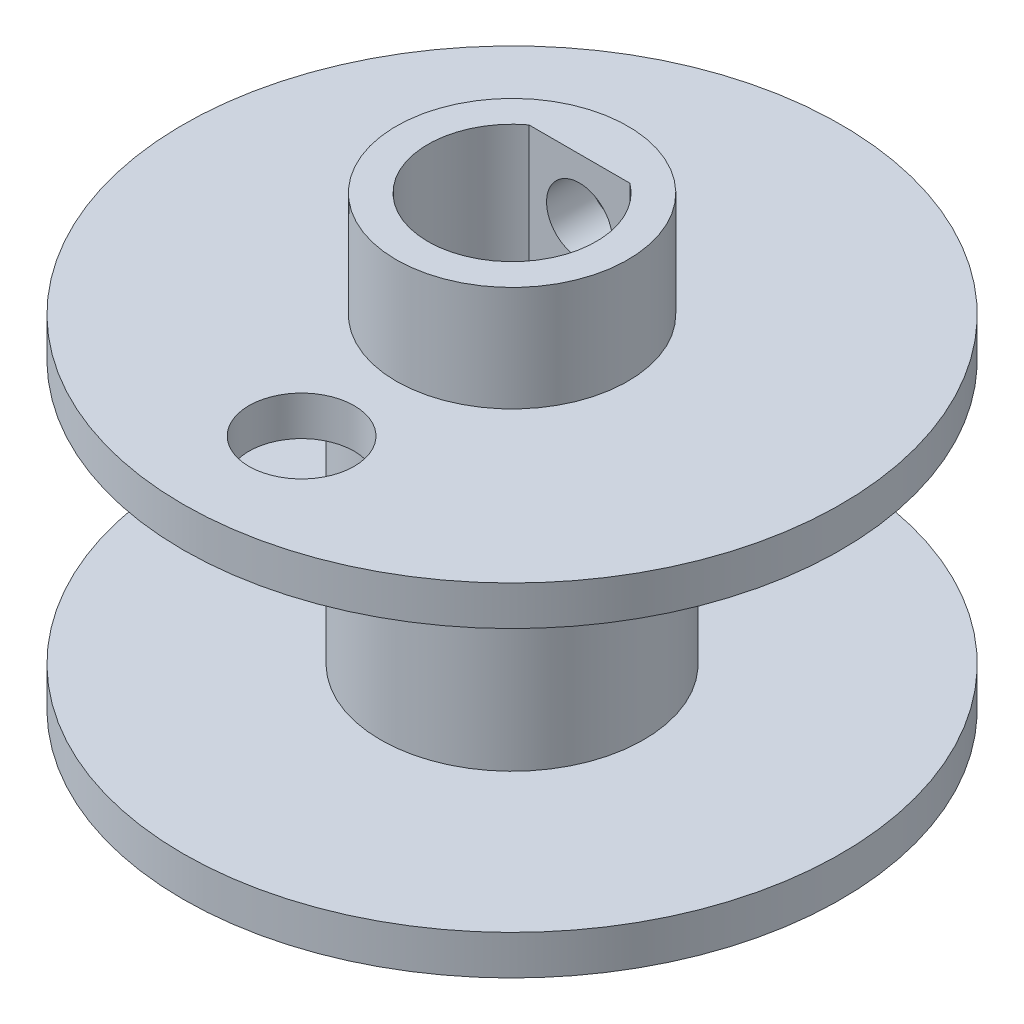
ISO-10303-21;
HEADER;
FILE_DESCRIPTION(('STEP AP214'),'2;1');
FILE_NAME('part.step','',(''),(''),'','','');
FILE_SCHEMA(('AUTOMOTIVE_DESIGN { 1 0 10303 214 1 1 1 1 }'));
ENDSEC;
DATA;
#1=APPLICATION_CONTEXT('core data for automotive mechanical design processes');
#2=APPLICATION_PROTOCOL_DEFINITION('international standard','automotive_design',2000,#1);
#3=PRODUCT_CONTEXT('',#1,'mechanical');
#4=PRODUCT('Part','Part','',(#3));
#5=PRODUCT_RELATED_PRODUCT_CATEGORY('part','',(#4));
#6=PRODUCT_DEFINITION_FORMATION('','',#4);
#7=PRODUCT_DEFINITION_CONTEXT('part definition',#1,'design');
#8=PRODUCT_DEFINITION('design','',#6,#7);
#9=PRODUCT_DEFINITION_SHAPE('','',#8);
#10=(LENGTH_UNIT() NAMED_UNIT(*) SI_UNIT(.MILLI.,.METRE.));
#11=(NAMED_UNIT(*) PLANE_ANGLE_UNIT() SI_UNIT($,.RADIAN.));
#12=(NAMED_UNIT(*) SI_UNIT($,.STERADIAN.) SOLID_ANGLE_UNIT());
#13=UNCERTAINTY_MEASURE_WITH_UNIT(LENGTH_MEASURE(1.E-05),#10,'distance_accuracy_value','');
#14=(GEOMETRIC_REPRESENTATION_CONTEXT(3) GLOBAL_UNCERTAINTY_ASSIGNED_CONTEXT((#13)) GLOBAL_UNIT_ASSIGNED_CONTEXT((#10,
#11,#12)) REPRESENTATION_CONTEXT('',''));
#15=CARTESIAN_POINT('',(0.,0.,0.));
#16=DIRECTION('',(0.,0.,1.));
#17=DIRECTION('',(1.,0.,0.));
#18=AXIS2_PLACEMENT_3D('',#15,#16,#17);
#19=CARTESIAN_POINT('',(0.,5.,0.));
#20=DIRECTION('',(0.,-1.,0.));
#21=DIRECTION('',(0.,0.,-1.));
#22=AXIS2_PLACEMENT_3D('',#19,#20,#21);
#23=CYLINDRICAL_SURFACE('',#22,5.);
#24=CARTESIAN_POINT('',(0.,5.,0.));
#25=DIRECTION('',(0.,1.,0.));
#26=DIRECTION('',(0.,0.,1.));
#27=AXIS2_PLACEMENT_3D('',#24,#25,#26);
#28=CIRCLE('',#27,5.);
#29=CARTESIAN_POINT('',(0.,5.,5.));
#30=VERTEX_POINT('',#29);
#31=EDGE_CURVE('E11',#30,#30,#28,.T.);
#32=ORIENTED_EDGE('',*,*,#31,.F.);
#33=EDGE_LOOP('',(#32));
#34=FACE_BOUND('',#33,.T.);
#35=CARTESIAN_POINT('',(0.,-5.,0.));
#36=DIRECTION('',(0.,1.,0.));
#37=DIRECTION('',(0.,0.,1.));
#38=AXIS2_PLACEMENT_3D('',#35,#36,#37);
#39=CIRCLE('',#38,5.);
#40=CARTESIAN_POINT('',(0.,-5.,5.));
#41=VERTEX_POINT('',#40);
#42=EDGE_CURVE('E105',#41,#41,#39,.T.);
#43=ORIENTED_EDGE('',*,*,#42,.T.);
#44=EDGE_LOOP('',(#43));
#45=FACE_BOUND('',#44,.T.);
#46=ADVANCED_FACE('F39',(#34,#45),#23,.T.);
#47=CARTESIAN_POINT('',(0.,6.5,0.));
#48=DIRECTION('',(0.,-1.,0.));
#49=DIRECTION('',(0.,0.,-1.));
#50=AXIS2_PLACEMENT_3D('',#47,#48,#49);
#51=CYLINDRICAL_SURFACE('',#50,12.5);
#52=CARTESIAN_POINT('',(0.,6.5,0.));
#53=DIRECTION('',(0.,1.,0.));
#54=DIRECTION('',(0.,0.,1.));
#55=AXIS2_PLACEMENT_3D('',#52,#53,#54);
#56=CIRCLE('',#55,12.5);
#57=CARTESIAN_POINT('',(0.,6.5,12.5));
#58=VERTEX_POINT('',#57);
#59=EDGE_CURVE('E52',#58,#58,#56,.T.);
#60=ORIENTED_EDGE('',*,*,#59,.F.);
#61=EDGE_LOOP('',(#60));
#62=FACE_BOUND('',#61,.T.);
#63=CARTESIAN_POINT('',(0.,5.,0.));
#64=DIRECTION('',(0.,1.,0.));
#65=DIRECTION('',(0.,0.,1.));
#66=AXIS2_PLACEMENT_3D('',#63,#64,#65);
#67=CIRCLE('',#66,12.5);
#68=CARTESIAN_POINT('',(0.,5.,12.5));
#69=VERTEX_POINT('',#68);
#70=EDGE_CURVE('E110',#69,#69,#67,.T.);
#71=ORIENTED_EDGE('',*,*,#70,.T.);
#72=EDGE_LOOP('',(#71));
#73=FACE_BOUND('',#72,.T.);
#74=ADVANCED_FACE('F139',(#62,#73),#51,.T.);
#75=CARTESIAN_POINT('',(0.,6.5,0.));
#76=DIRECTION('',(0.,1.,0.));
#77=DIRECTION('',(0.,0.,1.));
#78=AXIS2_PLACEMENT_3D('',#75,#76,#77);
#79=PLANE('',#78);
#80=CARTESIAN_POINT('',(0.,6.5,8.));
#81=DIRECTION('',(0.,1.,0.));
#82=DIRECTION('',(0.,0.,1.));
#83=AXIS2_PLACEMENT_3D('',#80,#81,#82);
#84=CIRCLE('',#83,2.);
#85=CARTESIAN_POINT('',(0.,6.5,10.));
#86=VERTEX_POINT('',#85);
#87=EDGE_CURVE('E161',#86,#86,#84,.T.);
#88=ORIENTED_EDGE('',*,*,#87,.F.);
#89=EDGE_LOOP('',(#88));
#90=FACE_BOUND('',#89,.T.);
#91=CARTESIAN_POINT('',(0.,6.5,0.));
#92=DIRECTION('',(0.,1.,0.));
#93=DIRECTION('',(0.,0.,1.));
#94=AXIS2_PLACEMENT_3D('',#91,#92,#93);
#95=CIRCLE('',#94,4.4);
#96=CARTESIAN_POINT('',(0.,6.5,4.4));
#97=VERTEX_POINT('',#96);
#98=EDGE_CURVE('E83',#97,#97,#95,.T.);
#99=ORIENTED_EDGE('',*,*,#98,.F.);
#100=EDGE_LOOP('',(#99));
#101=FACE_BOUND('',#100,.T.);
#102=ORIENTED_EDGE('',*,*,#59,.T.);
#103=EDGE_LOOP('',(#102));
#104=FACE_BOUND('',#103,.T.);
#105=ADVANCED_FACE('F134',(#90,#101,#104),#79,.T.);
#106=CARTESIAN_POINT('',(0.,5.,0.));
#107=DIRECTION('',(0.,1.,0.));
#108=DIRECTION('',(0.,0.,1.));
#109=AXIS2_PLACEMENT_3D('',#106,#107,#108);
#110=PLANE('',#109);
#111=CARTESIAN_POINT('',(0.,5.,8.));
#112=DIRECTION('',(0.,-1.,0.));
#113=DIRECTION('',(0.,0.,-1.));
#114=AXIS2_PLACEMENT_3D('',#111,#112,#113);
#115=CIRCLE('',#114,2.);
#116=CARTESIAN_POINT('',(0.,5.,6.));
#117=VERTEX_POINT('',#116);
#118=EDGE_CURVE('E234',#117,#117,#115,.T.);
#119=ORIENTED_EDGE('',*,*,#118,.F.);
#120=EDGE_LOOP('',(#119));
#121=FACE_BOUND('',#120,.T.);
#122=ORIENTED_EDGE('',*,*,#31,.T.);
#123=EDGE_LOOP('',(#122));
#124=FACE_BOUND('',#123,.T.);
#125=ORIENTED_EDGE('',*,*,#70,.F.);
#126=EDGE_LOOP('',(#125));
#127=FACE_BOUND('',#126,.T.);
#128=ADVANCED_FACE('F125',(#121,#124,#127),#110,.F.);
#129=CARTESIAN_POINT('',(0.,-6.5,0.));
#130=DIRECTION('',(0.,1.,0.));
#131=DIRECTION('',(0.,0.,1.));
#132=AXIS2_PLACEMENT_3D('',#129,#130,#131);
#133=CYLINDRICAL_SURFACE('',#132,12.5);
#134=CARTESIAN_POINT('',(0.,-6.5,0.));
#135=DIRECTION('',(0.,1.,0.));
#136=DIRECTION('',(0.,0.,1.));
#137=AXIS2_PLACEMENT_3D('',#134,#135,#136);
#138=CIRCLE('',#137,12.5);
#139=CARTESIAN_POINT('',(0.,-6.5,12.5));
#140=VERTEX_POINT('',#139);
#141=EDGE_CURVE('E102',#140,#140,#138,.T.);
#142=ORIENTED_EDGE('',*,*,#141,.T.);
#143=EDGE_LOOP('',(#142));
#144=FACE_BOUND('',#143,.T.);
#145=CARTESIAN_POINT('',(0.,-5.,0.));
#146=DIRECTION('',(0.,1.,0.));
#147=DIRECTION('',(0.,0.,1.));
#148=AXIS2_PLACEMENT_3D('',#145,#146,#147);
#149=CIRCLE('',#148,12.5);
#150=CARTESIAN_POINT('',(0.,-5.,12.5));
#151=VERTEX_POINT('',#150);
#152=EDGE_CURVE('E78',#151,#151,#149,.T.);
#153=ORIENTED_EDGE('',*,*,#152,.F.);
#154=EDGE_LOOP('',(#153));
#155=FACE_BOUND('',#154,.T.);
#156=ADVANCED_FACE('F123',(#144,#155),#133,.T.);
#157=CARTESIAN_POINT('',(0.,-6.5,0.));
#158=DIRECTION('',(0.,-1.,0.));
#159=DIRECTION('',(0.,0.,1.));
#160=AXIS2_PLACEMENT_3D('',#157,#158,#159);
#161=PLANE('',#160);
#162=CARTESIAN_POINT('',(0.,-6.5,0.));
#163=DIRECTION('',(0.,1.,0.));
#164=DIRECTION('',(0.,0.,1.));
#165=AXIS2_PLACEMENT_3D('',#162,#163,#164);
#166=CIRCLE('',#165,3.2);
#167=CARTESIAN_POINT('',(-1.92,-6.5,-2.56));
#168=VERTEX_POINT('',#167);
#169=CARTESIAN_POINT('',(1.92,-6.5,-2.56));
#170=VERTEX_POINT('',#169);
#171=EDGE_CURVE('E67',#168,#170,#166,.T.);
#172=ORIENTED_EDGE('',*,*,#171,.T.);
#173=DIRECTION('',(-1.,0.,0.));
#174=VECTOR('',#173,1.);
#175=CARTESIAN_POINT('',(-1.92,-6.5,-2.56));
#176=LINE('',#175,#174);
#177=EDGE_CURVE('E99',#170,#168,#176,.T.);
#178=ORIENTED_EDGE('',*,*,#177,.T.);
#179=EDGE_LOOP('',(#172,#178));
#180=FACE_BOUND('',#179,.T.);
#181=ORIENTED_EDGE('',*,*,#141,.F.);
#182=EDGE_LOOP('',(#181));
#183=FACE_BOUND('',#182,.T.);
#184=ADVANCED_FACE('F119',(#180,#183),#161,.T.);
#185=CARTESIAN_POINT('',(0.,-5.,0.));
#186=DIRECTION('',(0.,-1.,0.));
#187=DIRECTION('',(0.,0.,1.));
#188=AXIS2_PLACEMENT_3D('',#185,#186,#187);
#189=PLANE('',#188);
#190=ORIENTED_EDGE('',*,*,#42,.F.);
#191=EDGE_LOOP('',(#190));
#192=FACE_BOUND('',#191,.T.);
#193=ORIENTED_EDGE('',*,*,#152,.T.);
#194=EDGE_LOOP('',(#193));
#195=FACE_BOUND('',#194,.T.);
#196=ADVANCED_FACE('F116',(#192,#195),#189,.F.);
#197=CARTESIAN_POINT('',(0.,-6.5,0.));
#198=DIRECTION('',(0.,1.,0.));
#199=DIRECTION('',(0.,0.,1.));
#200=AXIS2_PLACEMENT_3D('',#197,#198,#199);
#201=CYLINDRICAL_SURFACE('',#200,3.2);
#202=DIRECTION('',(0.,1.,0.));
#203=VECTOR('',#202,1.);
#204=CARTESIAN_POINT('',(-1.92,-6.5,-2.56));
#205=LINE('',#204,#203);
#206=CARTESIAN_POINT('',(-1.92,10.5,-2.56));
#207=VERTEX_POINT('',#206);
#208=EDGE_CURVE('E72',#168,#207,#205,.T.);
#209=ORIENTED_EDGE('',*,*,#208,.T.);
#210=CARTESIAN_POINT('',(0.,10.5,0.));
#211=DIRECTION('',(0.,1.,0.));
#212=DIRECTION('',(0.,0.,1.));
#213=AXIS2_PLACEMENT_3D('',#210,#211,#212);
#214=CIRCLE('',#213,3.2);
#215=CARTESIAN_POINT('',(1.92,10.5,-2.56));
#216=VERTEX_POINT('',#215);
#217=EDGE_CURVE('E75',#207,#216,#214,.T.);
#218=ORIENTED_EDGE('',*,*,#217,.T.);
#219=DIRECTION('',(0.,1.,0.));
#220=VECTOR('',#219,1.);
#221=CARTESIAN_POINT('',(1.92,-6.5,-2.56));
#222=LINE('',#221,#220);
#223=EDGE_CURVE('E60',#170,#216,#222,.T.);
#224=ORIENTED_EDGE('',*,*,#223,.F.);
#225=ORIENTED_EDGE('',*,*,#171,.F.);
#226=EDGE_LOOP('',(#209,#218,#224,#225));
#227=FACE_BOUND('',#226,.T.);
#228=ADVANCED_FACE('F73',(#227),#201,.F.);
#229=CARTESIAN_POINT('',(-1.92,-6.5,-2.56));
#230=DIRECTION('',(0.,0.,-1.));
#231=DIRECTION('',(-1.,0.,0.));
#232=AXIS2_PLACEMENT_3D('',#229,#230,#231);
#233=PLANE('',#232);
#234=CARTESIAN_POINT('',(0.,8.3,-2.56));
#235=DIRECTION('',(0.,0.,1.));
#236=DIRECTION('',(1.,0.,0.));
#237=AXIS2_PLACEMENT_3D('',#234,#235,#236);
#238=CIRCLE('',#237,1.25);
#239=CARTESIAN_POINT('',(1.25,8.3,-2.56));
#240=VERTEX_POINT('',#239);
#241=EDGE_CURVE('E89',#240,#240,#238,.T.);
#242=ORIENTED_EDGE('',*,*,#241,.F.);
#243=EDGE_LOOP('',(#242));
#244=FACE_BOUND('',#243,.T.);
#245=ORIENTED_EDGE('',*,*,#223,.T.);
#246=DIRECTION('',(-1.,0.,0.));
#247=VECTOR('',#246,1.);
#248=CARTESIAN_POINT('',(-1.92,10.5,-2.56));
#249=LINE('',#248,#247);
#250=EDGE_CURVE('E80',#216,#207,#249,.T.);
#251=ORIENTED_EDGE('',*,*,#250,.T.);
#252=ORIENTED_EDGE('',*,*,#208,.F.);
#253=ORIENTED_EDGE('',*,*,#177,.F.);
#254=EDGE_LOOP('',(#245,#251,#252,#253));
#255=FACE_BOUND('',#254,.T.);
#256=ADVANCED_FACE('F81',(#244,#255),#233,.F.);
#257=CARTESIAN_POINT('',(0.,10.5,0.));
#258=DIRECTION('',(0.,-1.,0.));
#259=DIRECTION('',(0.,0.,-1.));
#260=AXIS2_PLACEMENT_3D('',#257,#258,#259);
#261=CYLINDRICAL_SURFACE('',#260,4.4);
#262=CARTESIAN_POINT('',(0.,9.55,-4.4));
#263=CARTESIAN_POINT('',(-0.0687382243203306,9.54999874810652,-4.39999916074674));
#264=CARTESIAN_POINT('',(-0.137489359868735,9.54431115545121,-4.39837359918321));
#265=CARTESIAN_POINT('',(-0.273000042818303,9.52175827848414,-4.39204723578843));
#266=CARTESIAN_POINT('',(-0.339758808247467,9.50488866417261,-4.3873452426837));
#267=CARTESIAN_POINT('',(-0.469309946932446,9.46057276157888,-4.37538308522348));
#268=CARTESIAN_POINT('',(-0.532107674587557,9.43314112346148,-4.36812646547872));
#269=CARTESIAN_POINT('',(-0.652211892254768,9.36853713732699,-4.35181545892181));
#270=CARTESIAN_POINT('',(-0.709517824723272,9.33136380173113,-4.34276088986249));
#271=CARTESIAN_POINT('',(-0.818502828675561,9.24731136402975,-4.32356212996409));
#272=CARTESIAN_POINT('',(-0.870018715509977,9.20022536965738,-4.31339738886636));
#273=CARTESIAN_POINT('',(-0.964539368473281,9.09812578272098,-4.2932510086516));
#274=CARTESIAN_POINT('',(-1.00754287498469,9.04311101897744,-4.28326939683107));
#275=CARTESIAN_POINT('',(-1.08464555249468,8.92537333537406,-4.26440563151995));
#276=CARTESIAN_POINT('',(-1.11855118788369,8.86251916887448,-4.2555492127336));
#277=CARTESIAN_POINT('',(-1.17524683169125,8.73170950028015,-4.24024331363101));
#278=CARTESIAN_POINT('',(-1.19803920097422,8.66375508520749,-4.23379332216998));
#279=CARTESIAN_POINT('',(-1.23128350816461,8.52649442422863,-4.22424375623779));
#280=CARTESIAN_POINT('',(-1.24203390382489,8.45726623413718,-4.22106331934919));
#281=CARTESIAN_POINT('',(-1.25182039545987,8.31792147913939,-4.21817188099679));
#282=CARTESIAN_POINT('',(-1.25085900494649,8.24780510807573,-4.21846013510359));
#283=CARTESIAN_POINT('',(-1.23748486831885,8.11105257270176,-4.22240149590221));
#284=CARTESIAN_POINT('',(-1.22543963576746,8.04437684844265,-4.22594660694857));
#285=CARTESIAN_POINT('',(-1.19083097899434,7.91403425167029,-4.23582840341038));
#286=CARTESIAN_POINT('',(-1.16826661354967,7.85036764896648,-4.24216533862776));
#287=CARTESIAN_POINT('',(-1.11297557009471,7.72692279576188,-4.25700721607372));
#288=CARTESIAN_POINT('',(-1.08012500319646,7.66720331788511,-4.26553834898779));
#289=CARTESIAN_POINT('',(-1.00528030553797,7.55399840127944,-4.28379406341026));
#290=CARTESIAN_POINT('',(-0.96328415954544,7.50051434052173,-4.29351890774708));
#291=CARTESIAN_POINT('',(-0.869488679010811,7.3992062675314,-4.31350998877267));
#292=CARTESIAN_POINT('',(-0.817382523863189,7.35166719493627,-4.32378290057781));
#293=CARTESIAN_POINT('',(-0.705810379418932,7.26593945877791,-4.34338984371583));
#294=CARTESIAN_POINT('',(-0.64634401748115,7.22775126893388,-4.35272382746815));
#295=CARTESIAN_POINT('',(-0.521259385918427,7.1616600259077,-4.36947213183443));
#296=CARTESIAN_POINT('',(-0.455609208736881,7.13381444491521,-4.37687565941186));
#297=CARTESIAN_POINT('',(-0.320299688161237,7.08964071325941,-4.38885108674765));
#298=CARTESIAN_POINT('',(-0.250641348111066,7.07330969366146,-4.39342369181577));
#299=CARTESIAN_POINT('',(-0.111719750860913,7.05308974227983,-4.39911289555166));
#300=CARTESIAN_POINT('',(-0.0425170976429818,7.04881405722554,-4.40033688331961));
#301=CARTESIAN_POINT('',(0.0956186335830964,7.05174996096657,-4.39950290086165));
#302=CARTESIAN_POINT('',(0.164551742568723,7.05896018837227,-4.39744531958992));
#303=CARTESIAN_POINT('',(0.298770845727739,7.08434813676551,-4.39034927342104));
#304=CARTESIAN_POINT('',(0.3641021066026,7.10230490710845,-4.38537089998735));
#305=CARTESIAN_POINT('',(0.490814704033527,7.14841493777009,-4.37300322129677));
#306=CARTESIAN_POINT('',(0.552195585082891,7.1765693714795,-4.36561363860462));
#307=CARTESIAN_POINT('',(0.670727411773067,7.24295787107157,-4.34899829224227));
#308=CARTESIAN_POINT('',(0.727759209834993,7.28139541595227,-4.33973650396123));
#309=CARTESIAN_POINT('',(0.83469707300197,7.36700770837525,-4.32044423127684));
#310=CARTESIAN_POINT('',(0.884601531206517,7.41418442072424,-4.31041357430841));
#311=CARTESIAN_POINT('',(0.977535959925084,7.517748201037,-4.29031002901968));
#312=CARTESIAN_POINT('',(1.02029170834645,7.57438361242,-4.28024624818911));
#313=CARTESIAN_POINT('',(1.09570513473564,7.69424215013276,-4.26156605139573));
#314=CARTESIAN_POINT('',(1.12836317188803,7.757465042033,-4.25294958395568));
#315=CARTESIAN_POINT('',(1.18241488154834,7.88843593106384,-4.23824024756476));
#316=CARTESIAN_POINT('',(1.2038688910029,7.95615742855224,-4.23213389960142));
#317=CARTESIAN_POINT('',(1.23501853991301,8.09445372799183,-4.22315013602424));
#318=CARTESIAN_POINT('',(1.24471769194203,8.16502767106133,-4.22027175585183));
#319=CARTESIAN_POINT('',(1.25186094480033,8.30419765112378,-4.21815791065468));
#320=CARTESIAN_POINT('',(1.2497488468743,8.37276922324904,-4.21879051539986));
#321=CARTESIAN_POINT('',(1.23437425455085,8.50853562384162,-4.22331422444908));
#322=CARTESIAN_POINT('',(1.22111212436831,8.57573049720526,-4.22720522231797));
#323=CARTESIAN_POINT('',(1.18408662604821,8.70619280864703,-4.23772354891743));
#324=CARTESIAN_POINT('',(1.16042924683644,8.76949271760998,-4.24432321663533));
#325=CARTESIAN_POINT('',(1.10336676821657,8.89127474178755,-4.25951283567783));
#326=CARTESIAN_POINT('',(1.06995996001983,8.94975601012983,-4.26810313584745));
#327=CARTESIAN_POINT('',(0.993052372130473,9.06232933391726,-4.28666053609878));
#328=CARTESIAN_POINT('',(0.949254531902347,9.11621250408674,-4.29666375058077));
#329=CARTESIAN_POINT('',(0.853357620934643,9.21600844806363,-4.31673217811048));
#330=CARTESIAN_POINT('',(0.801256469629382,9.26191921818106,-4.32679740608768));
#331=CARTESIAN_POINT('',(0.68864454165009,9.34561608547212,-4.34616038107759));
#332=CARTESIAN_POINT('',(0.627954530531277,9.38316756636826,-4.35543230787955));
#333=CARTESIAN_POINT('',(0.500859546993402,9.44747780757521,-4.37186846578862));
#334=CARTESIAN_POINT('',(0.434457771174089,9.47424255762473,-4.37903386602426));
#335=CARTESIAN_POINT('',(0.307053370991043,9.51327764920748,-4.38967440179803));
#336=CARTESIAN_POINT('',(0.246526822285517,9.52701391406577,-4.39351640058872));
#337=CARTESIAN_POINT('',(0.124003555981185,9.54537505999756,-4.39867941384186));
#338=CARTESIAN_POINT('',(0.0620070311770483,9.55000112930177,-4.40000075706935));
#339=CARTESIAN_POINT('',(0.,9.55,-4.4));
#340=B_SPLINE_CURVE_WITH_KNOTS('',3,(#262,#263,#264,#265,#266,#267,#268,#269,#270,#271,#272,
#273,#274,#275,#276,#277,#278,#279,#280,#281,#282,#283,#284,#285,#286,#287,#288,#289,#290,#291,
#292,#293,#294,#295,#296,#297,#298,#299,#300,#301,#302,#303,#304,#305,#306,#307,#308,#309,#310,
#311,#312,#313,#314,#315,#316,#317,#318,#319,#320,#321,#322,#323,#324,#325,#326,#327,#328,#329,
#330,#331,#332,#333,#334,#335,#336,#337,#338,#339),.UNSPECIFIED.,.T.,.F.,(4,2,2,2,2,2,2,2,2,2,2,
2,2,2,2,2,2,2,2,2,2,2,2,2,2,2,2,2,2,2,2,2,2,2,2,2,2,2,4),(0.,0.205987090582443,
0.412053991912938,0.617836089743211,0.823639057109079,1.03426122341641,1.24491453322879,
1.45974613882312,1.67453208641688,1.88386793470348,2.09315885740237,2.29575091228985,
2.49836109803478,2.70351205289955,2.90870825868871,3.12154569017298,3.33439390185062,
3.54840778265636,3.76236832152448,3.96938200369481,4.17637115100035,4.3792441165145,
4.58214043295789,4.78939401723308,4.99669425452814,5.21069257452247,5.42468328153023,
5.63750938335808,5.85027187303293,6.05509496069411,6.25991135808607,6.46268624366453,
6.66549669109273,6.87500861235898,7.08457311393398,7.2994330780975,7.5141735682381,
7.70001360587832,7.8858294030437),.UNSPECIFIED.);
#341=CARTESIAN_POINT('',(0.,9.55,-4.4));
#342=VERTEX_POINT('',#341);
#343=EDGE_CURVE('E42',#342,#342,#340,.T.);
#344=ORIENTED_EDGE('',*,*,#343,.T.);
#345=EDGE_LOOP('',(#344));
#346=FACE_BOUND('',#345,.T.);
#347=CARTESIAN_POINT('',(0.,10.5,0.));
#348=DIRECTION('',(0.,1.,0.));
#349=DIRECTION('',(0.,0.,1.));
#350=AXIS2_PLACEMENT_3D('',#347,#348,#349);
#351=CIRCLE('',#350,4.4);
#352=CARTESIAN_POINT('',(0.,10.5,4.4));
#353=VERTEX_POINT('',#352);
#354=EDGE_CURVE('E93',#353,#353,#351,.T.);
#355=ORIENTED_EDGE('',*,*,#354,.F.);
#356=EDGE_LOOP('',(#355));
#357=FACE_BOUND('',#356,.T.);
#358=ORIENTED_EDGE('',*,*,#98,.T.);
#359=EDGE_LOOP('',(#358));
#360=FACE_BOUND('',#359,.T.);
#361=ADVANCED_FACE('F164',(#346,#357,#360),#261,.T.);
#362=CARTESIAN_POINT('',(0.,10.5,0.));
#363=DIRECTION('',(0.,1.,0.));
#364=DIRECTION('',(0.,0.,1.));
#365=AXIS2_PLACEMENT_3D('',#362,#363,#364);
#366=PLANE('',#365);
#367=ORIENTED_EDGE('',*,*,#217,.F.);
#368=ORIENTED_EDGE('',*,*,#250,.F.);
#369=EDGE_LOOP('',(#367,#368));
#370=FACE_BOUND('',#369,.T.);
#371=ORIENTED_EDGE('',*,*,#354,.T.);
#372=EDGE_LOOP('',(#371));
#373=FACE_BOUND('',#372,.T.);
#374=ADVANCED_FACE('F85',(#370,#373),#366,.T.);
#375=CARTESIAN_POINT('',(0.,8.3,-12.5));
#376=DIRECTION('',(0.,0.,1.));
#377=DIRECTION('',(1.,0.,0.));
#378=AXIS2_PLACEMENT_3D('',#375,#376,#377);
#379=CYLINDRICAL_SURFACE('',#378,1.25);
#380=ORIENTED_EDGE('',*,*,#241,.T.);
#381=EDGE_LOOP('',(#380));
#382=FACE_BOUND('',#381,.T.);
#383=ORIENTED_EDGE('',*,*,#343,.F.);
#384=EDGE_LOOP('',(#383));
#385=FACE_BOUND('',#384,.T.);
#386=ADVANCED_FACE('F171',(#382,#385),#379,.F.);
#387=CARTESIAN_POINT('',(0.,10.5,8.));
#388=DIRECTION('',(0.,-1.,0.));
#389=DIRECTION('',(0.,0.,-1.));
#390=AXIS2_PLACEMENT_3D('',#387,#388,#389);
#391=CYLINDRICAL_SURFACE('',#390,2.);
#392=ORIENTED_EDGE('',*,*,#87,.T.);
#393=EDGE_LOOP('',(#392));
#394=FACE_BOUND('',#393,.T.);
#395=ORIENTED_EDGE('',*,*,#118,.T.);
#396=EDGE_LOOP('',(#395));
#397=FACE_BOUND('',#396,.T.);
#398=ADVANCED_FACE('F204',(#394,#397),#391,.F.);
#399=CLOSED_SHELL('',(#46,#74,#105,#128,#156,#184,#196,#228,#256,#361,#374,#386,#398));
#400=MANIFOLD_SOLID_BREP('B2',#399);
#401=ADVANCED_BREP_SHAPE_REPRESENTATION('',(#18,#400),#14);
#402=SHAPE_DEFINITION_REPRESENTATION(#9,#401);
ENDSEC;
END-ISO-10303-21;
